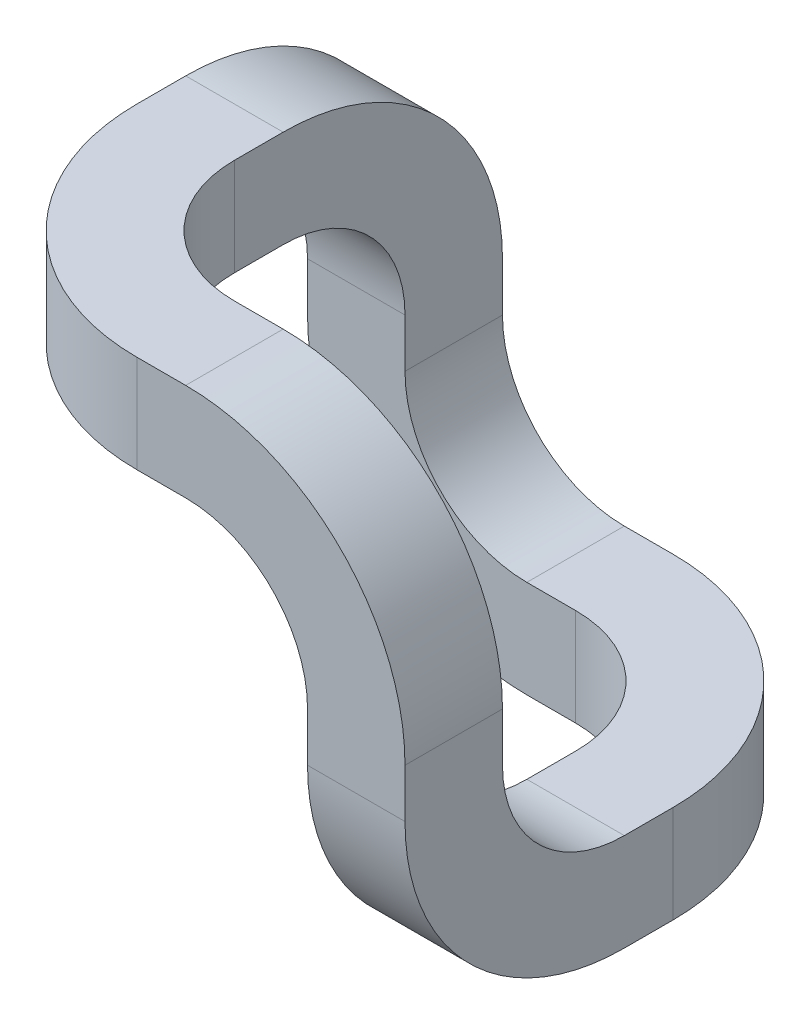
ISO-10303-21;
HEADER;
FILE_DESCRIPTION(('STEP AP214'),'2;1');
FILE_NAME('part.step','',(''),(''),'','','');
FILE_SCHEMA(('AUTOMOTIVE_DESIGN { 1 0 10303 214 1 1 1 1 }'));
ENDSEC;
DATA;
#1=APPLICATION_CONTEXT('core data for automotive mechanical design processes');
#2=APPLICATION_PROTOCOL_DEFINITION('international standard','automotive_design',2000,#1);
#3=PRODUCT_CONTEXT('',#1,'mechanical');
#4=PRODUCT('Part','Part','',(#3));
#5=PRODUCT_RELATED_PRODUCT_CATEGORY('part','',(#4));
#6=PRODUCT_DEFINITION_FORMATION('','',#4);
#7=PRODUCT_DEFINITION_CONTEXT('part definition',#1,'design');
#8=PRODUCT_DEFINITION('design','',#6,#7);
#9=PRODUCT_DEFINITION_SHAPE('','',#8);
#10=(LENGTH_UNIT() NAMED_UNIT(*) SI_UNIT(.MILLI.,.METRE.));
#11=(NAMED_UNIT(*) PLANE_ANGLE_UNIT() SI_UNIT($,.RADIAN.));
#12=(NAMED_UNIT(*) SI_UNIT($,.STERADIAN.) SOLID_ANGLE_UNIT());
#13=UNCERTAINTY_MEASURE_WITH_UNIT(LENGTH_MEASURE(1.E-05),#10,'distance_accuracy_value','');
#14=(GEOMETRIC_REPRESENTATION_CONTEXT(3) GLOBAL_UNCERTAINTY_ASSIGNED_CONTEXT((#13)) GLOBAL_UNIT_ASSIGNED_CONTEXT((#10,
#11,#12)) REPRESENTATION_CONTEXT('',''));
#15=CARTESIAN_POINT('',(0.,0.,0.));
#16=DIRECTION('',(0.,0.,1.));
#17=DIRECTION('',(1.,0.,0.));
#18=AXIS2_PLACEMENT_3D('',#15,#16,#17);
#19=CARTESIAN_POINT('',(20.,0.,10.));
#20=DIRECTION('',(-1.,0.,0.));
#21=DIRECTION('',(0.,0.,1.));
#22=AXIS2_PLACEMENT_3D('',#19,#20,#21);
#23=PLANE('',#22);
#24=DIRECTION('',(0.,1.,0.));
#25=VECTOR('',#24,1.);
#26=CARTESIAN_POINT('',(20.,0.,10.));
#27=LINE('',#26,#25);
#28=CARTESIAN_POINT('',(20.,9.,10.));
#29=VERTEX_POINT('',#28);
#30=CARTESIAN_POINT('',(20.,11.,10.));
#31=VERTEX_POINT('',#30);
#32=EDGE_CURVE('E212',#29,#31,#27,.T.);
#33=ORIENTED_EDGE('',*,*,#32,.F.);
#34=CARTESIAN_POINT('',(20.,9.,0.999999999999999));
#35=DIRECTION('',(-1.,0.,0.));
#36=DIRECTION('',(0.,0.,1.));
#37=AXIS2_PLACEMENT_3D('',#34,#35,#36);
#38=CIRCLE('',#37,9.);
#39=CARTESIAN_POINT('',(20.,0.,0.999999999999999));
#40=VERTEX_POINT('',#39);
#41=EDGE_CURVE('E283',#29,#40,#38,.F.);
#42=ORIENTED_EDGE('',*,*,#41,.T.);
#43=DIRECTION('',(0.,0.,-1.));
#44=VECTOR('',#43,1.);
#45=CARTESIAN_POINT('',(20.,0.,10.));
#46=LINE('',#45,#44);
#47=CARTESIAN_POINT('',(20.,0.,-0.999999999999999));
#48=VERTEX_POINT('',#47);
#49=EDGE_CURVE('E394',#40,#48,#46,.T.);
#50=ORIENTED_EDGE('',*,*,#49,.T.);
#51=DIRECTION('',(0.,1.,0.));
#52=VECTOR('',#51,1.);
#53=CARTESIAN_POINT('',(20.,4.,-0.999999999999999));
#54=LINE('',#53,#52);
#55=CARTESIAN_POINT('',(20.,4.,-0.999999999999999));
#56=VERTEX_POINT('',#55);
#57=EDGE_CURVE('E252',#48,#56,#54,.T.);
#58=ORIENTED_EDGE('',*,*,#57,.T.);
#59=DIRECTION('',(0.,0.,1.));
#60=VECTOR('',#59,1.);
#61=CARTESIAN_POINT('',(20.,4.,10.));
#62=LINE('',#61,#60);
#63=CARTESIAN_POINT('',(20.,4.,1.));
#64=VERTEX_POINT('',#63);
#65=EDGE_CURVE('E358',#56,#64,#62,.T.);
#66=ORIENTED_EDGE('',*,*,#65,.T.);
#67=CARTESIAN_POINT('',(20.,9.,1.));
#68=DIRECTION('',(-1.,0.,0.));
#69=DIRECTION('',(0.,0.,1.));
#70=AXIS2_PLACEMENT_3D('',#67,#68,#69);
#71=CIRCLE('',#70,5.);
#72=CARTESIAN_POINT('',(20.,9.,6.));
#73=VERTEX_POINT('',#72);
#74=EDGE_CURVE('E333',#64,#73,#71,.T.);
#75=ORIENTED_EDGE('',*,*,#74,.T.);
#76=DIRECTION('',(0.,1.,0.));
#77=VECTOR('',#76,1.);
#78=CARTESIAN_POINT('',(20.,0.,6.));
#79=LINE('',#78,#77);
#80=CARTESIAN_POINT('',(20.,11.,6.));
#81=VERTEX_POINT('',#80);
#82=EDGE_CURVE('E364',#73,#81,#79,.T.);
#83=ORIENTED_EDGE('',*,*,#82,.T.);
#84=DIRECTION('',(0.,0.,-1.));
#85=VECTOR('',#84,1.);
#86=CARTESIAN_POINT('',(20.,11.,10.));
#87=LINE('',#86,#85);
#88=EDGE_CURVE('E218',#81,#31,#87,.F.);
#89=ORIENTED_EDGE('',*,*,#88,.T.);
#90=EDGE_LOOP('',(#33,#42,#50,#58,#66,#75,#83,#89));
#91=FACE_BOUND('',#90,.T.);
#92=ADVANCED_FACE('F43',(#91),#23,.F.);
#93=CARTESIAN_POINT('',(0.,20.,10.));
#94=DIRECTION('',(0.,-1.,0.));
#95=DIRECTION('',(0.,0.,-1.));
#96=AXIS2_PLACEMENT_3D('',#93,#94,#95);
#97=PLANE('',#96);
#98=DIRECTION('',(-1.,0.,0.));
#99=VECTOR('',#98,1.);
#100=CARTESIAN_POINT('',(0.,20.,6.));
#101=LINE('',#100,#99);
#102=CARTESIAN_POINT('',(11.,20.,6.));
#103=VERTEX_POINT('',#102);
#104=CARTESIAN_POINT('',(9.,20.,6.));
#105=VERTEX_POINT('',#104);
#106=EDGE_CURVE('E373',#103,#105,#101,.T.);
#107=ORIENTED_EDGE('',*,*,#106,.T.);
#108=CARTESIAN_POINT('',(9.,20.,1.));
#109=DIRECTION('',(0.,-1.,0.));
#110=DIRECTION('',(0.,0.,-1.));
#111=AXIS2_PLACEMENT_3D('',#108,#109,#110);
#112=CIRCLE('',#111,5.);
#113=CARTESIAN_POINT('',(4.,20.,0.999999999999999));
#114=VERTEX_POINT('',#113);
#115=EDGE_CURVE('E295',#105,#114,#112,.T.);
#116=ORIENTED_EDGE('',*,*,#115,.T.);
#117=DIRECTION('',(0.,0.,-1.));
#118=VECTOR('',#117,1.);
#119=CARTESIAN_POINT('',(4.,20.,10.));
#120=LINE('',#119,#118);
#121=CARTESIAN_POINT('',(4.,20.,-0.999999999999999));
#122=VERTEX_POINT('',#121);
#123=EDGE_CURVE('E380',#114,#122,#120,.T.);
#124=ORIENTED_EDGE('',*,*,#123,.T.);
#125=DIRECTION('',(-1.,0.,0.));
#126=VECTOR('',#125,1.);
#127=CARTESIAN_POINT('',(0.,20.,-0.999999999999999));
#128=LINE('',#127,#126);
#129=CARTESIAN_POINT('',(0.,20.,-0.999999999999999));
#130=VERTEX_POINT('',#129);
#131=EDGE_CURVE('E270',#122,#130,#128,.T.);
#132=ORIENTED_EDGE('',*,*,#131,.T.);
#133=DIRECTION('',(0.,0.,-1.));
#134=VECTOR('',#133,1.);
#135=CARTESIAN_POINT('',(0.,20.,10.));
#136=LINE('',#135,#134);
#137=CARTESIAN_POINT('',(0.,20.,0.999999999999999));
#138=VERTEX_POINT('',#137);
#139=EDGE_CURVE('E229',#138,#130,#136,.T.);
#140=ORIENTED_EDGE('',*,*,#139,.F.);
#141=CARTESIAN_POINT('',(9.,20.,0.999999999999999));
#142=DIRECTION('',(0.,-1.,0.));
#143=DIRECTION('',(0.,0.,-1.));
#144=AXIS2_PLACEMENT_3D('',#141,#142,#143);
#145=CIRCLE('',#144,9.);
#146=CARTESIAN_POINT('',(9.,20.,10.));
#147=VERTEX_POINT('',#146);
#148=EDGE_CURVE('E228',#138,#147,#145,.F.);
#149=ORIENTED_EDGE('',*,*,#148,.T.);
#150=DIRECTION('',(-1.,0.,0.));
#151=VECTOR('',#150,1.);
#152=CARTESIAN_POINT('',(0.,20.,10.));
#153=LINE('',#152,#151);
#154=CARTESIAN_POINT('',(11.,20.,10.));
#155=VERTEX_POINT('',#154);
#156=EDGE_CURVE('E208',#155,#147,#153,.T.);
#157=ORIENTED_EDGE('',*,*,#156,.F.);
#158=DIRECTION('',(0.,0.,-1.));
#159=VECTOR('',#158,1.);
#160=CARTESIAN_POINT('',(11.,20.,10.));
#161=LINE('',#160,#159);
#162=EDGE_CURVE('E224',#155,#103,#161,.T.);
#163=ORIENTED_EDGE('',*,*,#162,.T.);
#164=EDGE_LOOP('',(#107,#116,#124,#132,#140,#149,#157,#163));
#165=FACE_BOUND('',#164,.T.);
#166=ADVANCED_FACE('F223',(#165),#97,.F.);
#167=CARTESIAN_POINT('',(0.,0.,-10.));
#168=DIRECTION('',(0.,0.,-1.));
#169=DIRECTION('',(-1.,0.,0.));
#170=AXIS2_PLACEMENT_3D('',#167,#168,#169);
#171=PLANE('',#170);
#172=DIRECTION('',(0.,-1.,0.));
#173=VECTOR('',#172,1.);
#174=CARTESIAN_POINT('',(0.,0.,-10.));
#175=LINE('',#174,#173);
#176=CARTESIAN_POINT('',(0.,11.,-10.));
#177=VERTEX_POINT('',#176);
#178=CARTESIAN_POINT('',(0.,9.,-10.));
#179=VERTEX_POINT('',#178);
#180=EDGE_CURVE('E386',#177,#179,#175,.T.);
#181=ORIENTED_EDGE('',*,*,#180,.F.);
#182=DIRECTION('',(-1.,0.,0.));
#183=VECTOR('',#182,1.);
#184=CARTESIAN_POINT('',(4.,11.,-10.));
#185=LINE('',#184,#183);
#186=CARTESIAN_POINT('',(4.,11.,-10.));
#187=VERTEX_POINT('',#186);
#188=EDGE_CURVE('E275',#177,#187,#185,.F.);
#189=ORIENTED_EDGE('',*,*,#188,.T.);
#190=DIRECTION('',(0.,1.,0.));
#191=VECTOR('',#190,1.);
#192=CARTESIAN_POINT('',(4.,0.,-10.));
#193=LINE('',#192,#191);
#194=CARTESIAN_POINT('',(4.,9.,-10.));
#195=VERTEX_POINT('',#194);
#196=EDGE_CURVE('E237',#195,#187,#193,.T.);
#197=ORIENTED_EDGE('',*,*,#196,.F.);
#198=CARTESIAN_POINT('',(9.,9.,-10.));
#199=DIRECTION('',(0.,0.,-1.));
#200=DIRECTION('',(-1.,0.,0.));
#201=AXIS2_PLACEMENT_3D('',#198,#199,#200);
#202=CIRCLE('',#201,5.);
#203=CARTESIAN_POINT('',(9.,4.,-10.));
#204=VERTEX_POINT('',#203);
#205=EDGE_CURVE('E326',#195,#204,#202,.F.);
#206=ORIENTED_EDGE('',*,*,#205,.T.);
#207=DIRECTION('',(-1.,0.,0.));
#208=VECTOR('',#207,1.);
#209=CARTESIAN_POINT('',(0.,4.,-10.));
#210=LINE('',#209,#208);
#211=CARTESIAN_POINT('',(11.,4.,-10.));
#212=VERTEX_POINT('',#211);
#213=EDGE_CURVE('E396',#212,#204,#210,.T.);
#214=ORIENTED_EDGE('',*,*,#213,.F.);
#215=DIRECTION('',(0.,1.,0.));
#216=VECTOR('',#215,1.);
#217=CARTESIAN_POINT('',(11.,0.,-10.));
#218=LINE('',#217,#216);
#219=CARTESIAN_POINT('',(11.,0.,-10.));
#220=VERTEX_POINT('',#219);
#221=EDGE_CURVE('E257',#212,#220,#218,.F.);
#222=ORIENTED_EDGE('',*,*,#221,.T.);
#223=DIRECTION('',(1.,0.,0.));
#224=VECTOR('',#223,1.);
#225=CARTESIAN_POINT('',(0.,0.,-10.));
#226=LINE('',#225,#224);
#227=CARTESIAN_POINT('',(9.,0.,-10.));
#228=VERTEX_POINT('',#227);
#229=EDGE_CURVE('E387',#228,#220,#226,.T.);
#230=ORIENTED_EDGE('',*,*,#229,.F.);
#231=CARTESIAN_POINT('',(9.,9.,-10.));
#232=DIRECTION('',(0.,0.,-1.));
#233=DIRECTION('',(-1.,0.,0.));
#234=AXIS2_PLACEMENT_3D('',#231,#232,#233);
#235=CIRCLE('',#234,9.);
#236=EDGE_CURVE('E244',#228,#179,#235,.T.);
#237=ORIENTED_EDGE('',*,*,#236,.T.);
#238=EDGE_LOOP('',(#181,#189,#197,#206,#214,#222,#230,#237));
#239=FACE_BOUND('',#238,.T.);
#240=ADVANCED_FACE('F406',(#239),#171,.T.);
#241=CARTESIAN_POINT('',(0.,0.,10.));
#242=DIRECTION('',(1.,0.,0.));
#243=DIRECTION('',(0.,0.,-1.));
#244=AXIS2_PLACEMENT_3D('',#241,#242,#243);
#245=PLANE('',#244);
#246=ORIENTED_EDGE('',*,*,#139,.T.);
#247=CARTESIAN_POINT('',(0.,11.,-0.999999999999999));
#248=DIRECTION('',(1.,0.,0.));
#249=DIRECTION('',(0.,0.,-1.));
#250=AXIS2_PLACEMENT_3D('',#247,#248,#249);
#251=CIRCLE('',#250,9.);
#252=EDGE_CURVE('E273',#130,#177,#251,.F.);
#253=ORIENTED_EDGE('',*,*,#252,.T.);
#254=ORIENTED_EDGE('',*,*,#180,.T.);
#255=DIRECTION('',(0.,0.,-1.));
#256=VECTOR('',#255,1.);
#257=CARTESIAN_POINT('',(0.,9.,10.));
#258=LINE('',#257,#256);
#259=CARTESIAN_POINT('',(0.,9.,-6.));
#260=VERTEX_POINT('',#259);
#261=EDGE_CURVE('E247',#179,#260,#258,.F.);
#262=ORIENTED_EDGE('',*,*,#261,.T.);
#263=DIRECTION('',(0.,1.,0.));
#264=VECTOR('',#263,1.);
#265=CARTESIAN_POINT('',(0.,0.,-6.));
#266=LINE('',#265,#264);
#267=CARTESIAN_POINT('',(0.,11.,-6.));
#268=VERTEX_POINT('',#267);
#269=EDGE_CURVE('E368',#260,#268,#266,.T.);
#270=ORIENTED_EDGE('',*,*,#269,.T.);
#271=CARTESIAN_POINT('',(0.,11.,-1.));
#272=DIRECTION('',(1.,0.,0.));
#273=DIRECTION('',(0.,0.,-1.));
#274=AXIS2_PLACEMENT_3D('',#271,#272,#273);
#275=CIRCLE('',#274,5.);
#276=CARTESIAN_POINT('',(0.,16.,-1.));
#277=VERTEX_POINT('',#276);
#278=EDGE_CURVE('E11',#268,#277,#275,.T.);
#279=ORIENTED_EDGE('',*,*,#278,.T.);
#280=DIRECTION('',(0.,0.,1.));
#281=VECTOR('',#280,1.);
#282=CARTESIAN_POINT('',(0.,16.,10.));
#283=LINE('',#282,#281);
#284=CARTESIAN_POINT('',(0.,16.,0.999999999999999));
#285=VERTEX_POINT('',#284);
#286=EDGE_CURVE('E347',#277,#285,#283,.T.);
#287=ORIENTED_EDGE('',*,*,#286,.T.);
#288=DIRECTION('',(0.,-1.,0.));
#289=VECTOR('',#288,1.);
#290=CARTESIAN_POINT('',(0.,0.,0.999999999999999));
#291=LINE('',#290,#289);
#292=EDGE_CURVE('E267',#285,#138,#291,.F.);
#293=ORIENTED_EDGE('',*,*,#292,.T.);
#294=EDGE_LOOP('',(#246,#253,#254,#262,#270,#279,#287,#293));
#295=FACE_BOUND('',#294,.T.);
#296=ADVANCED_FACE('F410',(#295),#245,.F.);
#297=CARTESIAN_POINT('',(0.,0.,10.));
#298=DIRECTION('',(0.,1.,0.));
#299=DIRECTION('',(0.,0.,1.));
#300=AXIS2_PLACEMENT_3D('',#297,#298,#299);
#301=PLANE('',#300);
#302=ORIENTED_EDGE('',*,*,#49,.F.);
#303=DIRECTION('',(1.,0.,0.));
#304=VECTOR('',#303,1.);
#305=CARTESIAN_POINT('',(0.,0.,0.999999999999999));
#306=LINE('',#305,#304);
#307=CARTESIAN_POINT('',(16.,0.,0.999999999999999));
#308=VERTEX_POINT('',#307);
#309=EDGE_CURVE('E285',#40,#308,#306,.F.);
#310=ORIENTED_EDGE('',*,*,#309,.T.);
#311=DIRECTION('',(0.,0.,-1.));
#312=VECTOR('',#311,1.);
#313=CARTESIAN_POINT('',(16.,0.,10.));
#314=LINE('',#313,#312);
#315=CARTESIAN_POINT('',(16.,0.,-0.999999999999999));
#316=VERTEX_POINT('',#315);
#317=EDGE_CURVE('E375',#308,#316,#314,.T.);
#318=ORIENTED_EDGE('',*,*,#317,.T.);
#319=CARTESIAN_POINT('',(11.,0.,-1.));
#320=DIRECTION('',(0.,1.,0.));
#321=DIRECTION('',(0.,0.,1.));
#322=AXIS2_PLACEMENT_3D('',#319,#320,#321);
#323=CIRCLE('',#322,5.);
#324=CARTESIAN_POINT('',(11.,0.,-6.));
#325=VERTEX_POINT('',#324);
#326=EDGE_CURVE('E307',#316,#325,#323,.T.);
#327=ORIENTED_EDGE('',*,*,#326,.T.);
#328=DIRECTION('',(-1.,0.,0.));
#329=VECTOR('',#328,1.);
#330=CARTESIAN_POINT('',(0.,0.,-6.));
#331=LINE('',#330,#329);
#332=CARTESIAN_POINT('',(9.,0.,-6.));
#333=VERTEX_POINT('',#332);
#334=EDGE_CURVE('E378',#325,#333,#331,.T.);
#335=ORIENTED_EDGE('',*,*,#334,.T.);
#336=DIRECTION('',(0.,0.,-1.));
#337=VECTOR('',#336,1.);
#338=CARTESIAN_POINT('',(9.,0.,10.));
#339=LINE('',#338,#337);
#340=EDGE_CURVE('E217',#333,#228,#339,.T.);
#341=ORIENTED_EDGE('',*,*,#340,.T.);
#342=ORIENTED_EDGE('',*,*,#229,.T.);
#343=CARTESIAN_POINT('',(11.,0.,-0.999999999999999));
#344=DIRECTION('',(0.,1.,0.));
#345=DIRECTION('',(0.,0.,1.));
#346=AXIS2_PLACEMENT_3D('',#343,#344,#345);
#347=CIRCLE('',#346,9.);
#348=EDGE_CURVE('E259',#220,#48,#347,.F.);
#349=ORIENTED_EDGE('',*,*,#348,.T.);
#350=EDGE_LOOP('',(#302,#310,#318,#327,#335,#341,#342,#349));
#351=FACE_BOUND('',#350,.T.);
#352=ADVANCED_FACE('F468',(#351),#301,.F.);
#353=CARTESIAN_POINT('',(0.,0.,10.));
#354=DIRECTION('',(0.,0.,-1.));
#355=DIRECTION('',(-1.,0.,0.));
#356=AXIS2_PLACEMENT_3D('',#353,#354,#355);
#357=PLANE('',#356);
#358=DIRECTION('',(1.,0.,0.));
#359=VECTOR('',#358,1.);
#360=CARTESIAN_POINT('',(0.,16.,10.));
#361=LINE('',#360,#359);
#362=CARTESIAN_POINT('',(9.,16.,10.));
#363=VERTEX_POINT('',#362);
#364=CARTESIAN_POINT('',(11.,16.,10.));
#365=VERTEX_POINT('',#364);
#366=EDGE_CURVE('E384',#363,#365,#361,.T.);
#367=ORIENTED_EDGE('',*,*,#366,.T.);
#368=CARTESIAN_POINT('',(11.,11.,10.));
#369=DIRECTION('',(0.,0.,-1.));
#370=DIRECTION('',(-1.,0.,0.));
#371=AXIS2_PLACEMENT_3D('',#368,#369,#370);
#372=CIRCLE('',#371,5.);
#373=CARTESIAN_POINT('',(16.,11.,10.));
#374=VERTEX_POINT('',#373);
#375=EDGE_CURVE('E314',#365,#374,#372,.T.);
#376=ORIENTED_EDGE('',*,*,#375,.T.);
#377=DIRECTION('',(0.,-1.,0.));
#378=VECTOR('',#377,1.);
#379=CARTESIAN_POINT('',(16.,0.,10.));
#380=LINE('',#379,#378);
#381=CARTESIAN_POINT('',(16.,9.,10.));
#382=VERTEX_POINT('',#381);
#383=EDGE_CURVE('E382',#374,#382,#380,.T.);
#384=ORIENTED_EDGE('',*,*,#383,.T.);
#385=DIRECTION('',(1.,0.,0.));
#386=VECTOR('',#385,1.);
#387=CARTESIAN_POINT('',(0.,9.,10.));
#388=LINE('',#387,#386);
#389=EDGE_CURVE('E281',#382,#29,#388,.T.);
#390=ORIENTED_EDGE('',*,*,#389,.T.);
#391=ORIENTED_EDGE('',*,*,#32,.T.);
#392=CARTESIAN_POINT('',(11.,11.,10.));
#393=DIRECTION('',(0.,0.,-1.));
#394=DIRECTION('',(-1.,0.,0.));
#395=AXIS2_PLACEMENT_3D('',#392,#393,#394);
#396=CIRCLE('',#395,9.);
#397=EDGE_CURVE('E203',#31,#155,#396,.F.);
#398=ORIENTED_EDGE('',*,*,#397,.T.);
#399=ORIENTED_EDGE('',*,*,#156,.T.);
#400=DIRECTION('',(0.,-1.,0.));
#401=VECTOR('',#400,1.);
#402=CARTESIAN_POINT('',(9.,0.,10.));
#403=LINE('',#402,#401);
#404=EDGE_CURVE('E262',#147,#363,#403,.T.);
#405=ORIENTED_EDGE('',*,*,#404,.T.);
#406=EDGE_LOOP('',(#367,#376,#384,#390,#391,#398,#399,#405));
#407=FACE_BOUND('',#406,.T.);
#408=ADVANCED_FACE('F206',(#407),#357,.F.);
#409=CARTESIAN_POINT('',(4.,4.,-19.));
#410=DIRECTION('',(-1.,0.,0.));
#411=DIRECTION('',(0.,0.,1.));
#412=AXIS2_PLACEMENT_3D('',#409,#410,#411);
#413=PLANE('',#412);
#414=DIRECTION('',(0.,0.,-1.));
#415=VECTOR('',#414,1.);
#416=CARTESIAN_POINT('',(4.,16.,-19.));
#417=LINE('',#416,#415);
#418=CARTESIAN_POINT('',(4.,16.,1.));
#419=VERTEX_POINT('',#418);
#420=CARTESIAN_POINT('',(4.,16.,-1.));
#421=VERTEX_POINT('',#420);
#422=EDGE_CURVE('E345',#419,#421,#417,.T.);
#423=ORIENTED_EDGE('',*,*,#422,.T.);
#424=CARTESIAN_POINT('',(4.,11.,-1.));
#425=DIRECTION('',(-1.,0.,0.));
#426=DIRECTION('',(0.,0.,1.));
#427=AXIS2_PLACEMENT_3D('',#424,#425,#426);
#428=CIRCLE('',#427,5.);
#429=CARTESIAN_POINT('',(4.,11.,-6.));
#430=VERTEX_POINT('',#429);
#431=EDGE_CURVE('E51',#421,#430,#428,.T.);
#432=ORIENTED_EDGE('',*,*,#431,.T.);
#433=DIRECTION('',(0.,-1.,0.));
#434=VECTOR('',#433,1.);
#435=CARTESIAN_POINT('',(4.,4.,-6.));
#436=LINE('',#435,#434);
#437=CARTESIAN_POINT('',(4.,9.,-6.));
#438=VERTEX_POINT('',#437);
#439=EDGE_CURVE('E366',#430,#438,#436,.T.);
#440=ORIENTED_EDGE('',*,*,#439,.T.);
#441=DIRECTION('',(0.,0.,1.));
#442=VECTOR('',#441,1.);
#443=CARTESIAN_POINT('',(4.,9.,-10.));
#444=LINE('',#443,#442);
#445=EDGE_CURVE('E321',#438,#195,#444,.F.);
#446=ORIENTED_EDGE('',*,*,#445,.T.);
#447=ORIENTED_EDGE('',*,*,#196,.T.);
#448=CARTESIAN_POINT('',(4.,11.,-0.999999999999999));
#449=DIRECTION('',(-1.,0.,0.));
#450=DIRECTION('',(0.,0.,1.));
#451=AXIS2_PLACEMENT_3D('',#448,#449,#450);
#452=CIRCLE('',#451,9.);
#453=EDGE_CURVE('E278',#187,#122,#452,.F.);
#454=ORIENTED_EDGE('',*,*,#453,.T.);
#455=ORIENTED_EDGE('',*,*,#123,.F.);
#456=DIRECTION('',(0.,1.,0.));
#457=VECTOR('',#456,1.);
#458=CARTESIAN_POINT('',(4.,16.,1.));
#459=LINE('',#458,#457);
#460=EDGE_CURVE('E293',#114,#419,#459,.F.);
#461=ORIENTED_EDGE('',*,*,#460,.T.);
#462=EDGE_LOOP('',(#423,#432,#440,#446,#447,#454,#455,#461));
#463=FACE_BOUND('',#462,.T.);
#464=ADVANCED_FACE('F350',(#463),#413,.F.);
#465=CARTESIAN_POINT('',(4.,4.,-19.));
#466=DIRECTION('',(0.,-1.,0.));
#467=DIRECTION('',(0.,0.,-1.));
#468=AXIS2_PLACEMENT_3D('',#465,#466,#467);
#469=PLANE('',#468);
#470=DIRECTION('',(0.,0.,-1.));
#471=VECTOR('',#470,1.);
#472=CARTESIAN_POINT('',(16.,4.,-19.));
#473=LINE('',#472,#471);
#474=CARTESIAN_POINT('',(16.,4.,1.));
#475=VERTEX_POINT('',#474);
#476=CARTESIAN_POINT('',(16.,4.,-1.));
#477=VERTEX_POINT('',#476);
#478=EDGE_CURVE('E354',#475,#477,#473,.T.);
#479=ORIENTED_EDGE('',*,*,#478,.F.);
#480=DIRECTION('',(1.,0.,0.));
#481=VECTOR('',#480,1.);
#482=CARTESIAN_POINT('',(20.,4.,1.));
#483=LINE('',#482,#481);
#484=EDGE_CURVE('E328',#475,#64,#483,.T.);
#485=ORIENTED_EDGE('',*,*,#484,.T.);
#486=ORIENTED_EDGE('',*,*,#65,.F.);
#487=CARTESIAN_POINT('',(11.,4.,-0.999999999999999));
#488=DIRECTION('',(0.,-1.,0.));
#489=DIRECTION('',(0.,0.,-1.));
#490=AXIS2_PLACEMENT_3D('',#487,#488,#489);
#491=CIRCLE('',#490,9.);
#492=EDGE_CURVE('E255',#56,#212,#491,.F.);
#493=ORIENTED_EDGE('',*,*,#492,.T.);
#494=ORIENTED_EDGE('',*,*,#213,.T.);
#495=DIRECTION('',(0.,0.,1.));
#496=VECTOR('',#495,1.);
#497=CARTESIAN_POINT('',(9.,4.,-6.));
#498=LINE('',#497,#496);
#499=CARTESIAN_POINT('',(9.,4.,-6.));
#500=VERTEX_POINT('',#499);
#501=EDGE_CURVE('E318',#204,#500,#498,.T.);
#502=ORIENTED_EDGE('',*,*,#501,.T.);
#503=DIRECTION('',(1.,0.,0.));
#504=VECTOR('',#503,1.);
#505=CARTESIAN_POINT('',(4.,4.,-6.));
#506=LINE('',#505,#504);
#507=CARTESIAN_POINT('',(11.,4.,-6.));
#508=VERTEX_POINT('',#507);
#509=EDGE_CURVE('E234',#500,#508,#506,.T.);
#510=ORIENTED_EDGE('',*,*,#509,.T.);
#511=CARTESIAN_POINT('',(11.,4.,-1.));
#512=DIRECTION('',(0.,-1.,0.));
#513=DIRECTION('',(0.,0.,-1.));
#514=AXIS2_PLACEMENT_3D('',#511,#512,#513);
#515=CIRCLE('',#514,5.);
#516=EDGE_CURVE('E304',#508,#477,#515,.T.);
#517=ORIENTED_EDGE('',*,*,#516,.T.);
#518=EDGE_LOOP('',(#479,#485,#486,#493,#494,#502,#510,#517));
#519=FACE_BOUND('',#518,.T.);
#520=ADVANCED_FACE('F447',(#519),#469,.F.);
#521=CARTESIAN_POINT('',(4.,16.,-19.));
#522=DIRECTION('',(0.,1.,0.));
#523=DIRECTION('',(0.,0.,1.));
#524=AXIS2_PLACEMENT_3D('',#521,#522,#523);
#525=PLANE('',#524);
#526=ORIENTED_EDGE('',*,*,#286,.F.);
#527=DIRECTION('',(1.,0.,0.));
#528=VECTOR('',#527,1.);
#529=CARTESIAN_POINT('',(4.,16.,-1.));
#530=LINE('',#529,#528);
#531=EDGE_CURVE('E337',#277,#421,#530,.T.);
#532=ORIENTED_EDGE('',*,*,#531,.T.);
#533=ORIENTED_EDGE('',*,*,#422,.F.);
#534=CARTESIAN_POINT('',(9.,16.,1.));
#535=DIRECTION('',(0.,1.,0.));
#536=DIRECTION('',(0.,0.,1.));
#537=AXIS2_PLACEMENT_3D('',#534,#535,#536);
#538=CIRCLE('',#537,5.);
#539=CARTESIAN_POINT('',(9.,16.,6.));
#540=VERTEX_POINT('',#539);
#541=EDGE_CURVE('E297',#419,#540,#538,.T.);
#542=ORIENTED_EDGE('',*,*,#541,.T.);
#543=DIRECTION('',(1.,0.,0.));
#544=VECTOR('',#543,1.);
#545=CARTESIAN_POINT('',(4.,16.,6.));
#546=LINE('',#545,#544);
#547=CARTESIAN_POINT('',(11.,16.,6.));
#548=VERTEX_POINT('',#547);
#549=EDGE_CURVE('E370',#540,#548,#546,.T.);
#550=ORIENTED_EDGE('',*,*,#549,.T.);
#551=DIRECTION('',(0.,0.,1.));
#552=VECTOR('',#551,1.);
#553=CARTESIAN_POINT('',(11.,16.,10.));
#554=LINE('',#553,#552);
#555=EDGE_CURVE('E309',#548,#365,#554,.T.);
#556=ORIENTED_EDGE('',*,*,#555,.T.);
#557=ORIENTED_EDGE('',*,*,#366,.F.);
#558=CARTESIAN_POINT('',(9.,16.,0.999999999999999));
#559=DIRECTION('',(0.,1.,0.));
#560=DIRECTION('',(0.,0.,1.));
#561=AXIS2_PLACEMENT_3D('',#558,#559,#560);
#562=CIRCLE('',#561,9.);
#563=EDGE_CURVE('E264',#363,#285,#562,.F.);
#564=ORIENTED_EDGE('',*,*,#563,.T.);
#565=EDGE_LOOP('',(#526,#532,#533,#542,#550,#556,#557,#564));
#566=FACE_BOUND('',#565,.T.);
#567=ADVANCED_FACE('F344',(#566),#525,.F.);
#568=CARTESIAN_POINT('',(16.,4.,-19.));
#569=DIRECTION('',(1.,0.,0.));
#570=DIRECTION('',(0.,0.,-1.));
#571=AXIS2_PLACEMENT_3D('',#568,#569,#570);
#572=PLANE('',#571);
#573=ORIENTED_EDGE('',*,*,#383,.F.);
#574=DIRECTION('',(0.,0.,1.));
#575=VECTOR('',#574,1.);
#576=CARTESIAN_POINT('',(16.,11.,6.));
#577=LINE('',#576,#575);
#578=CARTESIAN_POINT('',(16.,11.,6.));
#579=VERTEX_POINT('',#578);
#580=EDGE_CURVE('E312',#374,#579,#577,.F.);
#581=ORIENTED_EDGE('',*,*,#580,.T.);
#582=DIRECTION('',(0.,-1.,0.));
#583=VECTOR('',#582,1.);
#584=CARTESIAN_POINT('',(16.,4.,6.));
#585=LINE('',#584,#583);
#586=CARTESIAN_POINT('',(16.,9.,6.));
#587=VERTEX_POINT('',#586);
#588=EDGE_CURVE('E361',#579,#587,#585,.T.);
#589=ORIENTED_EDGE('',*,*,#588,.T.);
#590=CARTESIAN_POINT('',(16.,9.,1.));
#591=DIRECTION('',(1.,0.,0.));
#592=DIRECTION('',(0.,0.,-1.));
#593=AXIS2_PLACEMENT_3D('',#590,#591,#592);
#594=CIRCLE('',#593,5.);
#595=EDGE_CURVE('E335',#587,#475,#594,.T.);
#596=ORIENTED_EDGE('',*,*,#595,.T.);
#597=ORIENTED_EDGE('',*,*,#478,.T.);
#598=DIRECTION('',(0.,1.,0.));
#599=VECTOR('',#598,1.);
#600=CARTESIAN_POINT('',(16.,0.,-1.));
#601=LINE('',#600,#599);
#602=EDGE_CURVE('E302',#477,#316,#601,.F.);
#603=ORIENTED_EDGE('',*,*,#602,.T.);
#604=ORIENTED_EDGE('',*,*,#317,.F.);
#605=CARTESIAN_POINT('',(16.,9.,0.999999999999999));
#606=DIRECTION('',(1.,0.,0.));
#607=DIRECTION('',(0.,0.,-1.));
#608=AXIS2_PLACEMENT_3D('',#605,#606,#607);
#609=CIRCLE('',#608,9.);
#610=EDGE_CURVE('E287',#308,#382,#609,.F.);
#611=ORIENTED_EDGE('',*,*,#610,.T.);
#612=EDGE_LOOP('',(#573,#581,#589,#596,#597,#603,#604,#611));
#613=FACE_BOUND('',#612,.T.);
#614=ADVANCED_FACE('F423',(#613),#572,.F.);
#615=CARTESIAN_POINT('',(4.,-31.,-6.));
#616=DIRECTION('',(0.,0.,-1.));
#617=DIRECTION('',(-1.,0.,0.));
#618=AXIS2_PLACEMENT_3D('',#615,#616,#617);
#619=PLANE('',#618);
#620=ORIENTED_EDGE('',*,*,#439,.F.);
#621=DIRECTION('',(1.,0.,0.));
#622=VECTOR('',#621,1.);
#623=CARTESIAN_POINT('',(0.,11.,-6.));
#624=LINE('',#623,#622);
#625=EDGE_CURVE('E58',#430,#268,#624,.F.);
#626=ORIENTED_EDGE('',*,*,#625,.T.);
#627=ORIENTED_EDGE('',*,*,#269,.F.);
#628=CARTESIAN_POINT('',(9.,9.,-6.));
#629=DIRECTION('',(0.,0.,-1.));
#630=DIRECTION('',(-1.,0.,0.));
#631=AXIS2_PLACEMENT_3D('',#628,#629,#630);
#632=CIRCLE('',#631,9.);
#633=EDGE_CURVE('E249',#260,#333,#632,.F.);
#634=ORIENTED_EDGE('',*,*,#633,.T.);
#635=ORIENTED_EDGE('',*,*,#334,.F.);
#636=DIRECTION('',(0.,1.,0.));
#637=VECTOR('',#636,1.);
#638=CARTESIAN_POINT('',(11.,4.,-6.));
#639=LINE('',#638,#637);
#640=EDGE_CURVE('E299',#325,#508,#639,.T.);
#641=ORIENTED_EDGE('',*,*,#640,.T.);
#642=ORIENTED_EDGE('',*,*,#509,.F.);
#643=CARTESIAN_POINT('',(9.,9.,-6.));
#644=DIRECTION('',(0.,0.,-1.));
#645=DIRECTION('',(-1.,0.,0.));
#646=AXIS2_PLACEMENT_3D('',#643,#644,#645);
#647=CIRCLE('',#646,5.);
#648=EDGE_CURVE('E323',#500,#438,#647,.T.);
#649=ORIENTED_EDGE('',*,*,#648,.T.);
#650=EDGE_LOOP('',(#620,#626,#627,#634,#635,#641,#642,#649));
#651=FACE_BOUND('',#650,.T.);
#652=ADVANCED_FACE('F460',(#651),#619,.F.);
#653=CARTESIAN_POINT('',(4.,-31.,6.));
#654=DIRECTION('',(0.,0.,1.));
#655=DIRECTION('',(1.,0.,0.));
#656=AXIS2_PLACEMENT_3D('',#653,#654,#655);
#657=PLANE('',#656);
#658=ORIENTED_EDGE('',*,*,#82,.F.);
#659=DIRECTION('',(1.,0.,0.));
#660=VECTOR('',#659,1.);
#661=CARTESIAN_POINT('',(16.,9.,6.));
#662=LINE('',#661,#660);
#663=EDGE_CURVE('E331',#73,#587,#662,.F.);
#664=ORIENTED_EDGE('',*,*,#663,.T.);
#665=ORIENTED_EDGE('',*,*,#588,.F.);
#666=CARTESIAN_POINT('',(11.,11.,6.));
#667=DIRECTION('',(0.,0.,1.));
#668=DIRECTION('',(1.,0.,0.));
#669=AXIS2_PLACEMENT_3D('',#666,#667,#668);
#670=CIRCLE('',#669,5.);
#671=EDGE_CURVE('E316',#579,#548,#670,.T.);
#672=ORIENTED_EDGE('',*,*,#671,.T.);
#673=ORIENTED_EDGE('',*,*,#549,.F.);
#674=DIRECTION('',(0.,1.,0.));
#675=VECTOR('',#674,1.);
#676=CARTESIAN_POINT('',(9.,20.,6.));
#677=LINE('',#676,#675);
#678=EDGE_CURVE('E290',#540,#105,#677,.T.);
#679=ORIENTED_EDGE('',*,*,#678,.T.);
#680=ORIENTED_EDGE('',*,*,#106,.F.);
#681=CARTESIAN_POINT('',(11.,11.,6.));
#682=DIRECTION('',(0.,0.,1.));
#683=DIRECTION('',(1.,0.,0.));
#684=AXIS2_PLACEMENT_3D('',#681,#682,#683);
#685=CIRCLE('',#684,9.);
#686=EDGE_CURVE('E233',#103,#81,#685,.F.);
#687=ORIENTED_EDGE('',*,*,#686,.T.);
#688=EDGE_LOOP('',(#658,#664,#665,#672,#673,#679,#680,#687));
#689=FACE_BOUND('',#688,.T.);
#690=ADVANCED_FACE('F436',(#689),#657,.F.);
#691=CARTESIAN_POINT('',(11.,11.,10.));
#692=DIRECTION('',(0.,0.,-1.));
#693=DIRECTION('',(-1.,0.,0.));
#694=AXIS2_PLACEMENT_3D('',#691,#692,#693);
#695=CYLINDRICAL_SURFACE('',#694,9.);
#696=ORIENTED_EDGE('',*,*,#397,.F.);
#697=ORIENTED_EDGE('',*,*,#88,.F.);
#698=ORIENTED_EDGE('',*,*,#686,.F.);
#699=ORIENTED_EDGE('',*,*,#162,.F.);
#700=EDGE_LOOP('',(#696,#697,#698,#699));
#701=FACE_BOUND('',#700,.T.);
#702=ADVANCED_FACE('F231',(#701),#695,.T.);
#703=CARTESIAN_POINT('',(9.,9.,10.));
#704=DIRECTION('',(0.,0.,-1.));
#705=DIRECTION('',(-1.,0.,0.));
#706=AXIS2_PLACEMENT_3D('',#703,#704,#705);
#707=CYLINDRICAL_SURFACE('',#706,9.);
#708=ORIENTED_EDGE('',*,*,#633,.F.);
#709=ORIENTED_EDGE('',*,*,#261,.F.);
#710=ORIENTED_EDGE('',*,*,#236,.F.);
#711=ORIENTED_EDGE('',*,*,#340,.F.);
#712=EDGE_LOOP('',(#708,#709,#710,#711));
#713=FACE_BOUND('',#712,.T.);
#714=ADVANCED_FACE('F473',(#713),#707,.T.);
#715=CARTESIAN_POINT('',(11.,0.,-0.999999999999999));
#716=DIRECTION('',(0.,-1.,0.));
#717=DIRECTION('',(0.,0.,-1.));
#718=AXIS2_PLACEMENT_3D('',#715,#716,#717);
#719=CYLINDRICAL_SURFACE('',#718,9.);
#720=ORIENTED_EDGE('',*,*,#348,.F.);
#721=ORIENTED_EDGE('',*,*,#221,.F.);
#722=ORIENTED_EDGE('',*,*,#492,.F.);
#723=ORIENTED_EDGE('',*,*,#57,.F.);
#724=EDGE_LOOP('',(#720,#721,#722,#723));
#725=FACE_BOUND('',#724,.T.);
#726=ADVANCED_FACE('F451',(#725),#719,.T.);
#727=CARTESIAN_POINT('',(9.,0.,0.999999999999999));
#728=DIRECTION('',(0.,-1.,0.));
#729=DIRECTION('',(0.,0.,-1.));
#730=AXIS2_PLACEMENT_3D('',#727,#728,#729);
#731=CYLINDRICAL_SURFACE('',#730,9.);
#732=ORIENTED_EDGE('',*,*,#148,.F.);
#733=ORIENTED_EDGE('',*,*,#292,.F.);
#734=ORIENTED_EDGE('',*,*,#563,.F.);
#735=ORIENTED_EDGE('',*,*,#404,.F.);
#736=EDGE_LOOP('',(#732,#733,#734,#735));
#737=FACE_BOUND('',#736,.T.);
#738=ADVANCED_FACE('F413',(#737),#731,.T.);
#739=CARTESIAN_POINT('',(0.,11.,-0.999999999999999));
#740=DIRECTION('',(1.,0.,0.));
#741=DIRECTION('',(0.,0.,-1.));
#742=AXIS2_PLACEMENT_3D('',#739,#740,#741);
#743=CYLINDRICAL_SURFACE('',#742,9.);
#744=ORIENTED_EDGE('',*,*,#453,.F.);
#745=ORIENTED_EDGE('',*,*,#188,.F.);
#746=ORIENTED_EDGE('',*,*,#252,.F.);
#747=ORIENTED_EDGE('',*,*,#131,.F.);
#748=EDGE_LOOP('',(#744,#745,#746,#747));
#749=FACE_BOUND('',#748,.T.);
#750=ADVANCED_FACE('F408',(#749),#743,.T.);
#751=CARTESIAN_POINT('',(0.,9.,0.999999999999999));
#752=DIRECTION('',(1.,0.,0.));
#753=DIRECTION('',(0.,0.,-1.));
#754=AXIS2_PLACEMENT_3D('',#751,#752,#753);
#755=CYLINDRICAL_SURFACE('',#754,9.);
#756=ORIENTED_EDGE('',*,*,#610,.F.);
#757=ORIENTED_EDGE('',*,*,#309,.F.);
#758=ORIENTED_EDGE('',*,*,#41,.F.);
#759=ORIENTED_EDGE('',*,*,#389,.F.);
#760=EDGE_LOOP('',(#756,#757,#758,#759));
#761=FACE_BOUND('',#760,.T.);
#762=ADVANCED_FACE('F430',(#761),#755,.T.);
#763=CARTESIAN_POINT('',(9.,-31.,1.));
#764=DIRECTION('',(0.,-1.,0.));
#765=DIRECTION('',(0.,0.,-1.));
#766=AXIS2_PLACEMENT_3D('',#763,#764,#765);
#767=CYLINDRICAL_SURFACE('',#766,5.);
#768=ORIENTED_EDGE('',*,*,#541,.F.);
#769=ORIENTED_EDGE('',*,*,#460,.F.);
#770=ORIENTED_EDGE('',*,*,#115,.F.);
#771=ORIENTED_EDGE('',*,*,#678,.F.);
#772=EDGE_LOOP('',(#768,#769,#770,#771));
#773=FACE_BOUND('',#772,.T.);
#774=ADVANCED_FACE('F439',(#773),#767,.F.);
#775=CARTESIAN_POINT('',(11.,-31.,-1.));
#776=DIRECTION('',(0.,-1.,0.));
#777=DIRECTION('',(0.,0.,-1.));
#778=AXIS2_PLACEMENT_3D('',#775,#776,#777);
#779=CYLINDRICAL_SURFACE('',#778,5.);
#780=ORIENTED_EDGE('',*,*,#326,.F.);
#781=ORIENTED_EDGE('',*,*,#602,.F.);
#782=ORIENTED_EDGE('',*,*,#516,.F.);
#783=ORIENTED_EDGE('',*,*,#640,.F.);
#784=EDGE_LOOP('',(#780,#781,#782,#783));
#785=FACE_BOUND('',#784,.T.);
#786=ADVANCED_FACE('F465',(#785),#779,.F.);
#787=CARTESIAN_POINT('',(11.,11.,-19.));
#788=DIRECTION('',(0.,0.,-1.));
#789=DIRECTION('',(-1.,0.,0.));
#790=AXIS2_PLACEMENT_3D('',#787,#788,#789);
#791=CYLINDRICAL_SURFACE('',#790,5.);
#792=ORIENTED_EDGE('',*,*,#671,.F.);
#793=ORIENTED_EDGE('',*,*,#580,.F.);
#794=ORIENTED_EDGE('',*,*,#375,.F.);
#795=ORIENTED_EDGE('',*,*,#555,.F.);
#796=EDGE_LOOP('',(#792,#793,#794,#795));
#797=FACE_BOUND('',#796,.T.);
#798=ADVANCED_FACE('F419',(#797),#791,.F.);
#799=CARTESIAN_POINT('',(9.,9.,-19.));
#800=DIRECTION('',(0.,0.,-1.));
#801=DIRECTION('',(-1.,0.,0.));
#802=AXIS2_PLACEMENT_3D('',#799,#800,#801);
#803=CYLINDRICAL_SURFACE('',#802,5.);
#804=ORIENTED_EDGE('',*,*,#205,.F.);
#805=ORIENTED_EDGE('',*,*,#445,.F.);
#806=ORIENTED_EDGE('',*,*,#648,.F.);
#807=ORIENTED_EDGE('',*,*,#501,.F.);
#808=EDGE_LOOP('',(#804,#805,#806,#807));
#809=FACE_BOUND('',#808,.T.);
#810=ADVANCED_FACE('F457',(#809),#803,.F.);
#811=CARTESIAN_POINT('',(4.,9.,1.));
#812=DIRECTION('',(-1.,0.,0.));
#813=DIRECTION('',(0.,0.,1.));
#814=AXIS2_PLACEMENT_3D('',#811,#812,#813);
#815=CYLINDRICAL_SURFACE('',#814,5.);
#816=ORIENTED_EDGE('',*,*,#595,.F.);
#817=ORIENTED_EDGE('',*,*,#663,.F.);
#818=ORIENTED_EDGE('',*,*,#74,.F.);
#819=ORIENTED_EDGE('',*,*,#484,.F.);
#820=EDGE_LOOP('',(#816,#817,#818,#819));
#821=FACE_BOUND('',#820,.T.);
#822=ADVANCED_FACE('F444',(#821),#815,.F.);
#823=CARTESIAN_POINT('',(4.,11.,-1.));
#824=DIRECTION('',(-1.,0.,0.));
#825=DIRECTION('',(0.,0.,1.));
#826=AXIS2_PLACEMENT_3D('',#823,#824,#825);
#827=CYLINDRICAL_SURFACE('',#826,5.);
#828=ORIENTED_EDGE('',*,*,#278,.F.);
#829=ORIENTED_EDGE('',*,*,#625,.F.);
#830=ORIENTED_EDGE('',*,*,#431,.F.);
#831=ORIENTED_EDGE('',*,*,#531,.F.);
#832=EDGE_LOOP('',(#828,#829,#830,#831));
#833=FACE_BOUND('',#832,.T.);
#834=ADVANCED_FACE('F45',(#833),#827,.F.);
#835=CLOSED_SHELL('',(#92,#166,#240,#296,#352,#408,#464,#520,#567,#614,#652,#690,#702,#714,#726,
#738,#750,#762,#774,#786,#798,#810,#822,#834));
#836=MANIFOLD_SOLID_BREP('B2',#835);
#837=ADVANCED_BREP_SHAPE_REPRESENTATION('',(#18,#836),#14);
#838=SHAPE_DEFINITION_REPRESENTATION(#9,#837);
ENDSEC;
END-ISO-10303-21;
